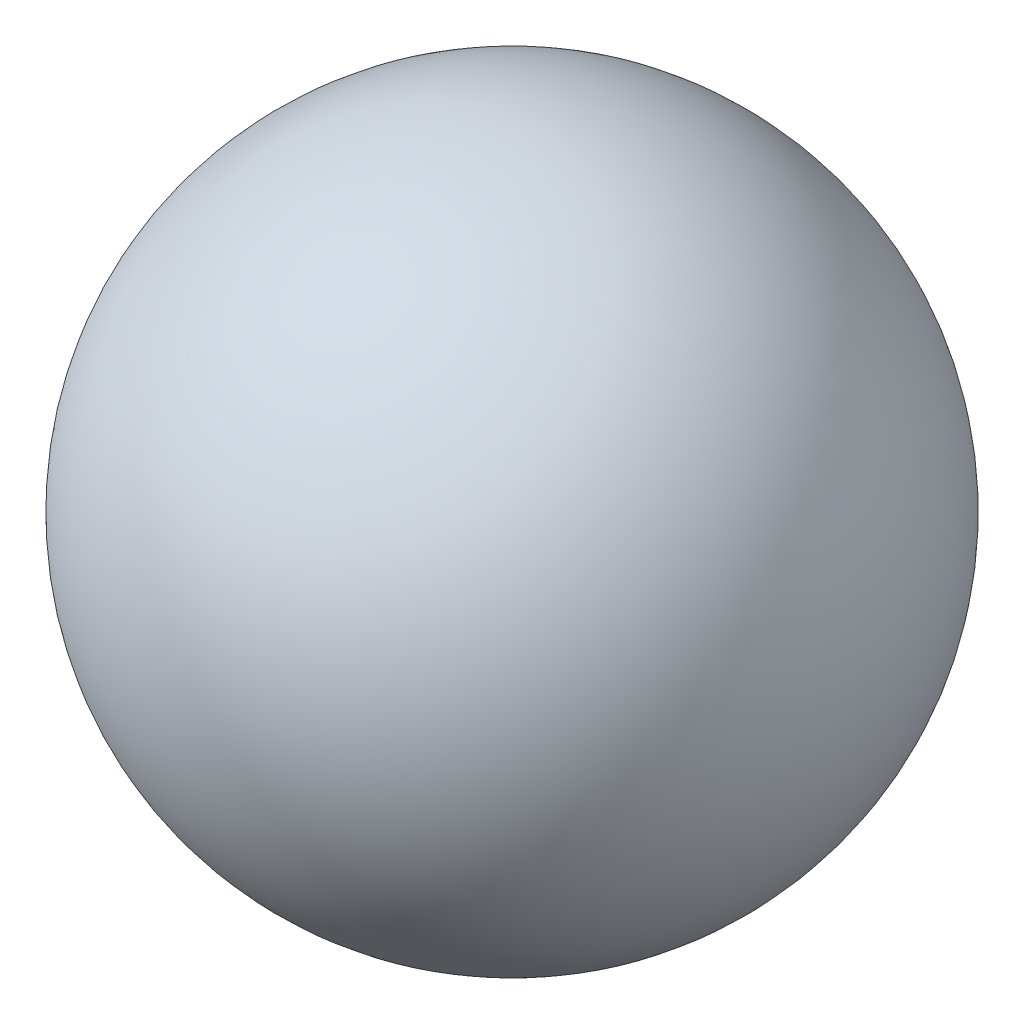
ISO-10303-21;
HEADER;
FILE_DESCRIPTION(('STEP AP214'),'2;1');
FILE_NAME('part.step','',(''),(''),'','','');
FILE_SCHEMA(('AUTOMOTIVE_DESIGN { 1 0 10303 214 1 1 1 1 }'));
ENDSEC;
DATA;
#1=APPLICATION_CONTEXT('core data for automotive mechanical design processes');
#2=APPLICATION_PROTOCOL_DEFINITION('international standard','automotive_design',2000,#1);
#3=PRODUCT_CONTEXT('',#1,'mechanical');
#4=PRODUCT('Part','Part','',(#3));
#5=PRODUCT_RELATED_PRODUCT_CATEGORY('part','',(#4));
#6=PRODUCT_DEFINITION_FORMATION('','',#4);
#7=PRODUCT_DEFINITION_CONTEXT('part definition',#1,'design');
#8=PRODUCT_DEFINITION('design','',#6,#7);
#9=PRODUCT_DEFINITION_SHAPE('','',#8);
#10=(LENGTH_UNIT() NAMED_UNIT(*) SI_UNIT(.MILLI.,.METRE.));
#11=(NAMED_UNIT(*) PLANE_ANGLE_UNIT() SI_UNIT($,.RADIAN.));
#12=(NAMED_UNIT(*) SI_UNIT($,.STERADIAN.) SOLID_ANGLE_UNIT());
#13=UNCERTAINTY_MEASURE_WITH_UNIT(LENGTH_MEASURE(1.E-05),#10,'distance_accuracy_value','');
#14=(GEOMETRIC_REPRESENTATION_CONTEXT(3) GLOBAL_UNCERTAINTY_ASSIGNED_CONTEXT((#13)) GLOBAL_UNIT_ASSIGNED_CONTEXT((#10,
#11,#12)) REPRESENTATION_CONTEXT('',''));
#15=CARTESIAN_POINT('',(0.,0.,0.));
#16=DIRECTION('',(0.,0.,1.));
#17=DIRECTION('',(1.,0.,0.));
#18=AXIS2_PLACEMENT_3D('',#15,#16,#17);
#19=CARTESIAN_POINT('',(0.,0.,0.));
#20=DIRECTION('',(0.,1.,0.));
#21=DIRECTION('',(1.,0.,0.));
#22=AXIS2_PLACEMENT_3D('',#19,#20,#21);
#23=SPHERICAL_SURFACE('',#22,36.5);
#24=CARTESIAN_POINT('',(0.,36.5,0.));
#25=VERTEX_POINT('',#24);
#26=VERTEX_LOOP('',#25);
#27=FACE_BOUND('',#26,.T.);
#28=ADVANCED_FACE('F28',(#27),#23,.T.);
#29=CLOSED_SHELL('',(#28));
#30=MANIFOLD_SOLID_BREP('B2',#29);
#31=ADVANCED_BREP_SHAPE_REPRESENTATION('',(#18,#30),#14);
#32=SHAPE_DEFINITION_REPRESENTATION(#9,#31);
ENDSEC;
END-ISO-10303-21;
